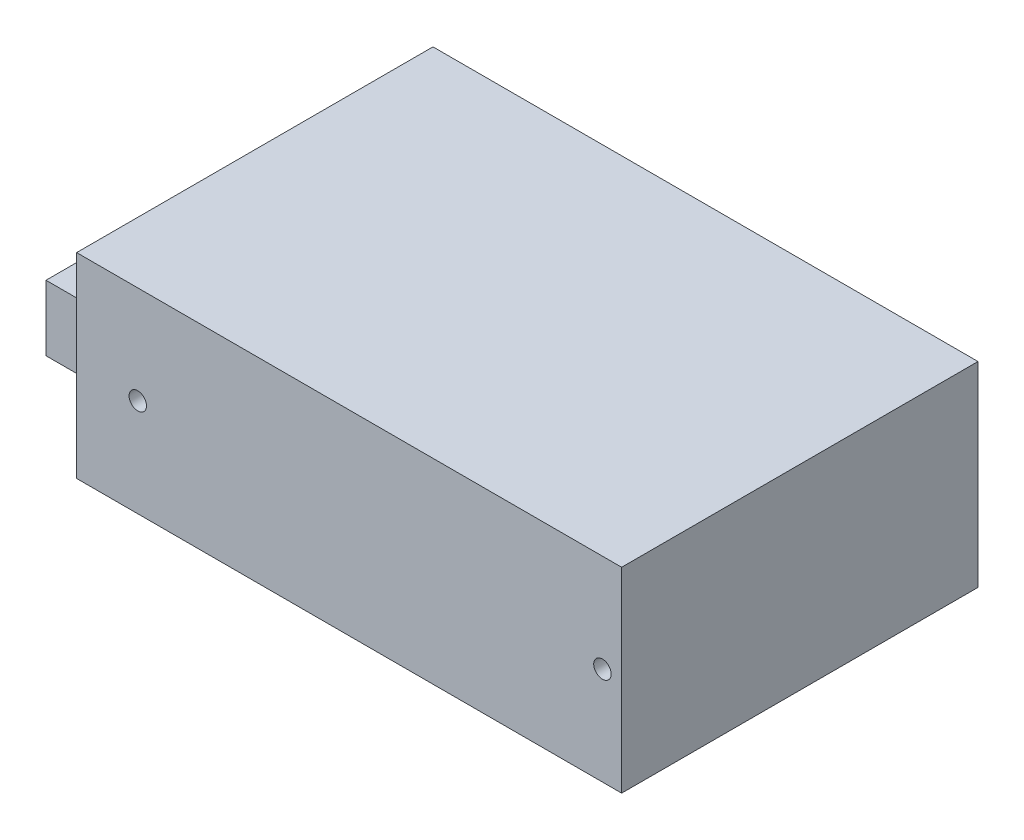
ISO-10303-21;
HEADER;
FILE_DESCRIPTION(('STEP AP214'),'2;1');
FILE_NAME('part.step','',(''),(''),'','','');
FILE_SCHEMA(('AUTOMOTIVE_DESIGN { 1 0 10303 214 1 1 1 1 }'));
ENDSEC;
DATA;
#1=APPLICATION_CONTEXT('core data for automotive mechanical design processes');
#2=APPLICATION_PROTOCOL_DEFINITION('international standard','automotive_design',2000,#1);
#3=PRODUCT_CONTEXT('',#1,'mechanical');
#4=PRODUCT('Part','Part','',(#3));
#5=PRODUCT_RELATED_PRODUCT_CATEGORY('part','',(#4));
#6=PRODUCT_DEFINITION_FORMATION('','',#4);
#7=PRODUCT_DEFINITION_CONTEXT('part definition',#1,'design');
#8=PRODUCT_DEFINITION('design','',#6,#7);
#9=PRODUCT_DEFINITION_SHAPE('','',#8);
#10=(LENGTH_UNIT() NAMED_UNIT(*) SI_UNIT(.MILLI.,.METRE.));
#11=(NAMED_UNIT(*) PLANE_ANGLE_UNIT() SI_UNIT($,.RADIAN.));
#12=(NAMED_UNIT(*) SI_UNIT($,.STERADIAN.) SOLID_ANGLE_UNIT());
#13=UNCERTAINTY_MEASURE_WITH_UNIT(LENGTH_MEASURE(1.E-05),#10,'distance_accuracy_value','');
#14=(GEOMETRIC_REPRESENTATION_CONTEXT(3) GLOBAL_UNCERTAINTY_ASSIGNED_CONTEXT((#13)) GLOBAL_UNIT_ASSIGNED_CONTEXT((#10,
#11,#12)) REPRESENTATION_CONTEXT('',''));
#15=CARTESIAN_POINT('',(0.,0.,0.));
#16=DIRECTION('',(0.,0.,1.));
#17=DIRECTION('',(1.,0.,0.));
#18=AXIS2_PLACEMENT_3D('',#15,#16,#17);
#19=CARTESIAN_POINT('',(-39.,28.,25.5));
#20=DIRECTION('',(1.,0.,0.));
#21=DIRECTION('',(0.,0.,-1.));
#22=AXIS2_PLACEMENT_3D('',#19,#20,#21);
#23=PLANE('',#22);
#24=DIRECTION('',(0.,0.,1.));
#25=VECTOR('',#24,1.);
#26=CARTESIAN_POINT('',(-39.,0.,25.5));
#27=LINE('',#26,#25);
#28=CARTESIAN_POINT('',(-39.,0.,-25.5));
#29=VERTEX_POINT('',#28);
#30=CARTESIAN_POINT('',(-39.,0.,25.5));
#31=VERTEX_POINT('',#30);
#32=EDGE_CURVE('E165',#29,#31,#27,.T.);
#33=ORIENTED_EDGE('',*,*,#32,.T.);
#34=DIRECTION('',(0.,-1.,0.));
#35=VECTOR('',#34,1.);
#36=CARTESIAN_POINT('',(-39.,28.,25.5));
#37=LINE('',#36,#35);
#38=CARTESIAN_POINT('',(-39.,28.,25.5));
#39=VERTEX_POINT('',#38);
#40=EDGE_CURVE('E11',#39,#31,#37,.T.);
#41=ORIENTED_EDGE('',*,*,#40,.F.);
#42=DIRECTION('',(0.,0.,1.));
#43=VECTOR('',#42,1.);
#44=CARTESIAN_POINT('',(-39.,28.,25.5));
#45=LINE('',#44,#43);
#46=CARTESIAN_POINT('',(-39.,28.,-25.5));
#47=VERTEX_POINT('',#46);
#48=EDGE_CURVE('E166',#47,#39,#45,.T.);
#49=ORIENTED_EDGE('',*,*,#48,.F.);
#50=DIRECTION('',(0.,-1.,0.));
#51=VECTOR('',#50,1.);
#52=CARTESIAN_POINT('',(-39.,28.,-25.5));
#53=LINE('',#52,#51);
#54=EDGE_CURVE('E176',#47,#29,#53,.T.);
#55=ORIENTED_EDGE('',*,*,#54,.T.);
#56=EDGE_LOOP('',(#33,#41,#49,#55));
#57=FACE_BOUND('',#56,.T.);
#58=DIRECTION('',(0.,-1.,0.));
#59=VECTOR('',#58,1.);
#60=CARTESIAN_POINT('',(-39.,3.40163827483973,-20.6707501637126));
#61=LINE('',#60,#59);
#62=CARTESIAN_POINT('',(-39.,12.7639627764704,-20.6707501637126));
#63=VERTEX_POINT('',#62);
#64=CARTESIAN_POINT('',(-39.,3.40163827483974,-20.6707501637126));
#65=VERTEX_POINT('',#64);
#66=EDGE_CURVE('E135',#63,#65,#61,.T.);
#67=ORIENTED_EDGE('',*,*,#66,.F.);
#68=DIRECTION('',(0.,0.,-1.));
#69=VECTOR('',#68,1.);
#70=CARTESIAN_POINT('',(-39.,12.7639627764704,-20.6707501637126));
#71=LINE('',#70,#69);
#72=CARTESIAN_POINT('',(-39.,12.7639627764704,15.8843932555756));
#73=VERTEX_POINT('',#72);
#74=EDGE_CURVE('E132',#73,#63,#71,.T.);
#75=ORIENTED_EDGE('',*,*,#74,.F.);
#76=DIRECTION('',(0.,1.,0.));
#77=VECTOR('',#76,1.);
#78=CARTESIAN_POINT('',(-39.,3.40163827483973,15.8843932555756));
#79=LINE('',#78,#77);
#80=CARTESIAN_POINT('',(-39.,3.40163827483974,15.8843932555756));
#81=VERTEX_POINT('',#80);
#82=EDGE_CURVE('E58',#81,#73,#79,.T.);
#83=ORIENTED_EDGE('',*,*,#82,.F.);
#84=DIRECTION('',(0.,0.,1.));
#85=VECTOR('',#84,1.);
#86=CARTESIAN_POINT('',(-39.,3.40163827483973,-20.6707501637126));
#87=LINE('',#86,#85);
#88=EDGE_CURVE('E53',#65,#81,#87,.T.);
#89=ORIENTED_EDGE('',*,*,#88,.F.);
#90=EDGE_LOOP('',(#67,#75,#83,#89));
#91=FACE_BOUND('',#90,.T.);
#92=ADVANCED_FACE('F39',(#57,#91),#23,.F.);
#93=CARTESIAN_POINT('',(39.,28.,25.5));
#94=DIRECTION('',(0.,0.,-1.));
#95=DIRECTION('',(-1.,0.,0.));
#96=AXIS2_PLACEMENT_3D('',#93,#94,#95);
#97=PLANE('',#96);
#98=CARTESIAN_POINT('',(36.25,14.,25.5));
#99=DIRECTION('',(0.,0.,1.));
#100=DIRECTION('',(1.,0.,0.));
#101=AXIS2_PLACEMENT_3D('',#98,#99,#100);
#102=CIRCLE('',#101,1.24999999999999);
#103=CARTESIAN_POINT('',(37.5,14.,25.5));
#104=VERTEX_POINT('',#103);
#105=EDGE_CURVE('E153',#104,#104,#102,.T.);
#106=ORIENTED_EDGE('',*,*,#105,.F.);
#107=EDGE_LOOP('',(#106));
#108=FACE_BOUND('',#107,.T.);
#109=CARTESIAN_POINT('',(-30.25,14.,25.5));
#110=DIRECTION('',(0.,0.,1.));
#111=DIRECTION('',(1.,0.,0.));
#112=AXIS2_PLACEMENT_3D('',#109,#110,#111);
#113=CIRCLE('',#112,1.24999999999999);
#114=CARTESIAN_POINT('',(-29.,14.,25.5));
#115=VERTEX_POINT('',#114);
#116=EDGE_CURVE('E159',#115,#115,#113,.T.);
#117=ORIENTED_EDGE('',*,*,#116,.F.);
#118=EDGE_LOOP('',(#117));
#119=FACE_BOUND('',#118,.T.);
#120=DIRECTION('',(1.,0.,0.));
#121=VECTOR('',#120,1.);
#122=CARTESIAN_POINT('',(39.,0.,25.5));
#123=LINE('',#122,#121);
#124=CARTESIAN_POINT('',(39.,0.,25.5));
#125=VERTEX_POINT('',#124);
#126=EDGE_CURVE('E179',#31,#125,#123,.T.);
#127=ORIENTED_EDGE('',*,*,#126,.T.);
#128=DIRECTION('',(0.,-1.,0.));
#129=VECTOR('',#128,1.);
#130=CARTESIAN_POINT('',(39.,28.,25.5));
#131=LINE('',#130,#129);
#132=CARTESIAN_POINT('',(39.,28.,25.5));
#133=VERTEX_POINT('',#132);
#134=EDGE_CURVE('E46',#133,#125,#131,.T.);
#135=ORIENTED_EDGE('',*,*,#134,.F.);
#136=DIRECTION('',(1.,0.,0.));
#137=VECTOR('',#136,1.);
#138=CARTESIAN_POINT('',(39.,28.,25.5));
#139=LINE('',#138,#137);
#140=EDGE_CURVE('E169',#39,#133,#139,.T.);
#141=ORIENTED_EDGE('',*,*,#140,.F.);
#142=ORIENTED_EDGE('',*,*,#40,.T.);
#143=EDGE_LOOP('',(#127,#135,#141,#142));
#144=FACE_BOUND('',#143,.T.);
#145=ADVANCED_FACE('F209',(#108,#119,#144),#97,.F.);
#146=CARTESIAN_POINT('',(39.,28.,25.5));
#147=DIRECTION('',(-1.,0.,0.));
#148=DIRECTION('',(0.,0.,1.));
#149=AXIS2_PLACEMENT_3D('',#146,#147,#148);
#150=PLANE('',#149);
#151=DIRECTION('',(0.,0.,-1.));
#152=VECTOR('',#151,1.);
#153=CARTESIAN_POINT('',(39.,0.,25.5));
#154=LINE('',#153,#152);
#155=CARTESIAN_POINT('',(39.,0.,-25.5));
#156=VERTEX_POINT('',#155);
#157=EDGE_CURVE('E181',#125,#156,#154,.T.);
#158=ORIENTED_EDGE('',*,*,#157,.T.);
#159=DIRECTION('',(0.,-1.,0.));
#160=VECTOR('',#159,1.);
#161=CARTESIAN_POINT('',(39.,28.,-25.5));
#162=LINE('',#161,#160);
#163=CARTESIAN_POINT('',(39.,28.,-25.5));
#164=VERTEX_POINT('',#163);
#165=EDGE_CURVE('E186',#164,#156,#162,.T.);
#166=ORIENTED_EDGE('',*,*,#165,.F.);
#167=DIRECTION('',(0.,0.,-1.));
#168=VECTOR('',#167,1.);
#169=CARTESIAN_POINT('',(39.,28.,25.5));
#170=LINE('',#169,#168);
#171=EDGE_CURVE('E172',#133,#164,#170,.T.);
#172=ORIENTED_EDGE('',*,*,#171,.F.);
#173=ORIENTED_EDGE('',*,*,#134,.T.);
#174=EDGE_LOOP('',(#158,#166,#172,#173));
#175=FACE_BOUND('',#174,.T.);
#176=ADVANCED_FACE('F193',(#175),#150,.F.);
#177=CARTESIAN_POINT('',(39.,28.,-25.5));
#178=DIRECTION('',(0.,0.,1.));
#179=DIRECTION('',(1.,0.,0.));
#180=AXIS2_PLACEMENT_3D('',#177,#178,#179);
#181=PLANE('',#180);
#182=DIRECTION('',(-1.,0.,0.));
#183=VECTOR('',#182,1.);
#184=CARTESIAN_POINT('',(39.,0.,-25.5));
#185=LINE('',#184,#183);
#186=EDGE_CURVE('E170',#156,#29,#185,.T.);
#187=ORIENTED_EDGE('',*,*,#186,.T.);
#188=ORIENTED_EDGE('',*,*,#54,.F.);
#189=DIRECTION('',(-1.,0.,0.));
#190=VECTOR('',#189,1.);
#191=CARTESIAN_POINT('',(39.,28.,-25.5));
#192=LINE('',#191,#190);
#193=EDGE_CURVE('E174',#164,#47,#192,.T.);
#194=ORIENTED_EDGE('',*,*,#193,.F.);
#195=ORIENTED_EDGE('',*,*,#165,.T.);
#196=EDGE_LOOP('',(#187,#188,#194,#195));
#197=FACE_BOUND('',#196,.T.);
#198=ADVANCED_FACE('F202',(#197),#181,.F.);
#199=CARTESIAN_POINT('',(0.,28.,0.));
#200=DIRECTION('',(0.,1.,0.));
#201=DIRECTION('',(0.,0.,1.));
#202=AXIS2_PLACEMENT_3D('',#199,#200,#201);
#203=PLANE('',#202);
#204=ORIENTED_EDGE('',*,*,#48,.T.);
#205=ORIENTED_EDGE('',*,*,#140,.T.);
#206=ORIENTED_EDGE('',*,*,#171,.T.);
#207=ORIENTED_EDGE('',*,*,#193,.T.);
#208=EDGE_LOOP('',(#204,#205,#206,#207));
#209=FACE_BOUND('',#208,.T.);
#210=ADVANCED_FACE('F208',(#209),#203,.T.);
#211=CARTESIAN_POINT('',(0.,0.,0.));
#212=DIRECTION('',(0.,1.,0.));
#213=DIRECTION('',(0.,0.,1.));
#214=AXIS2_PLACEMENT_3D('',#211,#212,#213);
#215=PLANE('',#214);
#216=CARTESIAN_POINT('',(28.,0.,0.100000000000003));
#217=DIRECTION('',(0.,-1.,0.));
#218=DIRECTION('',(0.,0.,-1.));
#219=AXIS2_PLACEMENT_3D('',#216,#217,#218);
#220=CIRCLE('',#219,1.24999999999999);
#221=CARTESIAN_POINT('',(28.,0.,-1.14999999999998));
#222=VERTEX_POINT('',#221);
#223=EDGE_CURVE('E136',#222,#222,#220,.T.);
#224=ORIENTED_EDGE('',*,*,#223,.F.);
#225=EDGE_LOOP('',(#224));
#226=FACE_BOUND('',#225,.T.);
#227=CARTESIAN_POINT('',(-27.,0.,0.100000000000003));
#228=DIRECTION('',(0.,-1.,0.));
#229=DIRECTION('',(0.,0.,-1.));
#230=AXIS2_PLACEMENT_3D('',#227,#228,#229);
#231=CIRCLE('',#230,1.24999999999999);
#232=CARTESIAN_POINT('',(-27.,0.,-1.14999999999998));
#233=VERTEX_POINT('',#232);
#234=EDGE_CURVE('E147',#233,#233,#231,.T.);
#235=ORIENTED_EDGE('',*,*,#234,.F.);
#236=EDGE_LOOP('',(#235));
#237=FACE_BOUND('',#236,.T.);
#238=ORIENTED_EDGE('',*,*,#32,.F.);
#239=ORIENTED_EDGE('',*,*,#186,.F.);
#240=ORIENTED_EDGE('',*,*,#157,.F.);
#241=ORIENTED_EDGE('',*,*,#126,.F.);
#242=EDGE_LOOP('',(#238,#239,#240,#241));
#243=FACE_BOUND('',#242,.T.);
#244=ADVANCED_FACE('F199',(#226,#237,#243),#215,.F.);
#245=CARTESIAN_POINT('',(-30.25,14.,20.));
#246=DIRECTION('',(0.,0.,1.));
#247=DIRECTION('',(1.,0.,0.));
#248=AXIS2_PLACEMENT_3D('',#245,#246,#247);
#249=CONICAL_SURFACE('',#248,1.25,1.02974425867665);
#250=CARTESIAN_POINT('',(-30.25,14.,19.2489242262155));
#251=VERTEX_POINT('',#250);
#252=VERTEX_LOOP('',#251);
#253=FACE_BOUND('',#252,.T.);
#254=CARTESIAN_POINT('',(-30.25,14.,20.));
#255=DIRECTION('',(0.,0.,1.));
#256=DIRECTION('',(1.,0.,0.));
#257=AXIS2_PLACEMENT_3D('',#254,#255,#256);
#258=CIRCLE('',#257,1.25);
#259=CARTESIAN_POINT('',(-29.,14.,20.));
#260=VERTEX_POINT('',#259);
#261=EDGE_CURVE('E162',#260,#260,#258,.T.);
#262=ORIENTED_EDGE('',*,*,#261,.T.);
#263=EDGE_LOOP('',(#262));
#264=FACE_BOUND('',#263,.T.);
#265=ADVANCED_FACE('F224',(#253,#264),#249,.F.);
#266=CARTESIAN_POINT('',(-30.25,14.,25.5));
#267=DIRECTION('',(0.,0.,1.));
#268=DIRECTION('',(1.,0.,0.));
#269=AXIS2_PLACEMENT_3D('',#266,#267,#268);
#270=CYLINDRICAL_SURFACE('',#269,1.24999999999999);
#271=ORIENTED_EDGE('',*,*,#261,.F.);
#272=EDGE_LOOP('',(#271));
#273=FACE_BOUND('',#272,.T.);
#274=ORIENTED_EDGE('',*,*,#116,.T.);
#275=EDGE_LOOP('',(#274));
#276=FACE_BOUND('',#275,.T.);
#277=ADVANCED_FACE('F230',(#273,#276),#270,.F.);
#278=CARTESIAN_POINT('',(36.25,14.,20.));
#279=DIRECTION('',(0.,0.,1.));
#280=DIRECTION('',(1.,0.,0.));
#281=AXIS2_PLACEMENT_3D('',#278,#279,#280);
#282=CONICAL_SURFACE('',#281,1.25,1.02974425867666);
#283=CARTESIAN_POINT('',(36.25,14.,19.2489242262155));
#284=VERTEX_POINT('',#283);
#285=VERTEX_LOOP('',#284);
#286=FACE_BOUND('',#285,.T.);
#287=CARTESIAN_POINT('',(36.25,14.,20.));
#288=DIRECTION('',(0.,0.,1.));
#289=DIRECTION('',(1.,0.,0.));
#290=AXIS2_PLACEMENT_3D('',#287,#288,#289);
#291=CIRCLE('',#290,1.25);
#292=CARTESIAN_POINT('',(37.5,14.,20.));
#293=VERTEX_POINT('',#292);
#294=EDGE_CURVE('E156',#293,#293,#291,.T.);
#295=ORIENTED_EDGE('',*,*,#294,.T.);
#296=EDGE_LOOP('',(#295));
#297=FACE_BOUND('',#296,.T.);
#298=ADVANCED_FACE('F234',(#286,#297),#282,.F.);
#299=CARTESIAN_POINT('',(36.25,14.,25.5));
#300=DIRECTION('',(0.,0.,1.));
#301=DIRECTION('',(1.,0.,0.));
#302=AXIS2_PLACEMENT_3D('',#299,#300,#301);
#303=CYLINDRICAL_SURFACE('',#302,1.24999999999999);
#304=ORIENTED_EDGE('',*,*,#294,.F.);
#305=EDGE_LOOP('',(#304));
#306=FACE_BOUND('',#305,.T.);
#307=ORIENTED_EDGE('',*,*,#105,.T.);
#308=EDGE_LOOP('',(#307));
#309=FACE_BOUND('',#308,.T.);
#310=ADVANCED_FACE('F238',(#306,#309),#303,.F.);
#311=CARTESIAN_POINT('',(-27.,5.50000000000001,0.100000000000003));
#312=DIRECTION('',(0.,-1.,0.));
#313=DIRECTION('',(0.,0.,-1.));
#314=AXIS2_PLACEMENT_3D('',#311,#312,#313);
#315=CONICAL_SURFACE('',#314,1.24999999999999,1.02974425867665);
#316=CARTESIAN_POINT('',(-27.,6.25107577378445,0.100000000000003));
#317=VERTEX_POINT('',#316);
#318=VERTEX_LOOP('',#317);
#319=FACE_BOUND('',#318,.T.);
#320=CARTESIAN_POINT('',(-27.,5.50000000000001,0.100000000000003));
#321=DIRECTION('',(0.,-1.,0.));
#322=DIRECTION('',(0.,0.,-1.));
#323=AXIS2_PLACEMENT_3D('',#320,#321,#322);
#324=CIRCLE('',#323,1.24999999999999);
#325=CARTESIAN_POINT('',(-27.,5.50000000000001,-1.14999999999998));
#326=VERTEX_POINT('',#325);
#327=EDGE_CURVE('E150',#326,#326,#324,.T.);
#328=ORIENTED_EDGE('',*,*,#327,.T.);
#329=EDGE_LOOP('',(#328));
#330=FACE_BOUND('',#329,.T.);
#331=ADVANCED_FACE('F242',(#319,#330),#315,.F.);
#332=CARTESIAN_POINT('',(-27.,0.,0.100000000000003));
#333=DIRECTION('',(0.,-1.,0.));
#334=DIRECTION('',(0.,0.,-1.));
#335=AXIS2_PLACEMENT_3D('',#332,#333,#334);
#336=CYLINDRICAL_SURFACE('',#335,1.24999999999999);
#337=ORIENTED_EDGE('',*,*,#327,.F.);
#338=EDGE_LOOP('',(#337));
#339=FACE_BOUND('',#338,.T.);
#340=ORIENTED_EDGE('',*,*,#234,.T.);
#341=EDGE_LOOP('',(#340));
#342=FACE_BOUND('',#341,.T.);
#343=ADVANCED_FACE('F246',(#339,#342),#336,.F.);
#344=CARTESIAN_POINT('',(28.,5.50000000000001,0.100000000000003));
#345=DIRECTION('',(0.,-1.,0.));
#346=DIRECTION('',(0.,0.,-1.));
#347=AXIS2_PLACEMENT_3D('',#344,#345,#346);
#348=CONICAL_SURFACE('',#347,1.24999999999999,1.02974425867665);
#349=CARTESIAN_POINT('',(28.,6.25107577378445,0.100000000000003));
#350=VERTEX_POINT('',#349);
#351=VERTEX_LOOP('',#350);
#352=FACE_BOUND('',#351,.T.);
#353=CARTESIAN_POINT('',(28.,5.50000000000001,0.100000000000003));
#354=DIRECTION('',(0.,-1.,0.));
#355=DIRECTION('',(0.,0.,-1.));
#356=AXIS2_PLACEMENT_3D('',#353,#354,#355);
#357=CIRCLE('',#356,1.24999999999999);
#358=CARTESIAN_POINT('',(28.,5.50000000000001,-1.14999999999998));
#359=VERTEX_POINT('',#358);
#360=EDGE_CURVE('E139',#359,#359,#357,.T.);
#361=ORIENTED_EDGE('',*,*,#360,.T.);
#362=EDGE_LOOP('',(#361));
#363=FACE_BOUND('',#362,.T.);
#364=ADVANCED_FACE('F250',(#352,#363),#348,.F.);
#365=CARTESIAN_POINT('',(28.,0.,0.100000000000003));
#366=DIRECTION('',(0.,-1.,0.));
#367=DIRECTION('',(0.,0.,-1.));
#368=AXIS2_PLACEMENT_3D('',#365,#366,#367);
#369=CYLINDRICAL_SURFACE('',#368,1.24999999999999);
#370=ORIENTED_EDGE('',*,*,#360,.F.);
#371=EDGE_LOOP('',(#370));
#372=FACE_BOUND('',#371,.T.);
#373=ORIENTED_EDGE('',*,*,#223,.T.);
#374=EDGE_LOOP('',(#373));
#375=FACE_BOUND('',#374,.T.);
#376=ADVANCED_FACE('F254',(#372,#375),#369,.F.);
#377=CARTESIAN_POINT('',(-53.,3.40163827483973,-20.6707501637126));
#378=DIRECTION('',(0.,0.,1.));
#379=DIRECTION('',(1.,0.,0.));
#380=AXIS2_PLACEMENT_3D('',#377,#378,#379);
#381=PLANE('',#380);
#382=ORIENTED_EDGE('',*,*,#66,.T.);
#383=DIRECTION('',(1.,0.,0.));
#384=VECTOR('',#383,1.);
#385=CARTESIAN_POINT('',(-53.,3.40163827483973,-20.6707501637126));
#386=LINE('',#385,#384);
#387=CARTESIAN_POINT('',(-53.,3.40163827483973,-20.6707501637126));
#388=VERTEX_POINT('',#387);
#389=EDGE_CURVE('E116',#388,#65,#386,.T.);
#390=ORIENTED_EDGE('',*,*,#389,.F.);
#391=DIRECTION('',(0.,-1.,0.));
#392=VECTOR('',#391,1.);
#393=CARTESIAN_POINT('',(-53.,3.40163827483973,-20.6707501637126));
#394=LINE('',#393,#392);
#395=CARTESIAN_POINT('',(-53.,12.7639627764704,-20.6707501637126));
#396=VERTEX_POINT('',#395);
#397=EDGE_CURVE('E123',#396,#388,#394,.T.);
#398=ORIENTED_EDGE('',*,*,#397,.F.);
#399=DIRECTION('',(1.,0.,0.));
#400=VECTOR('',#399,1.);
#401=CARTESIAN_POINT('',(-53.,12.7639627764704,-20.6707501637126));
#402=LINE('',#401,#400);
#403=EDGE_CURVE('E402',#396,#63,#402,.T.);
#404=ORIENTED_EDGE('',*,*,#403,.T.);
#405=EDGE_LOOP('',(#382,#390,#398,#404));
#406=FACE_BOUND('',#405,.T.);
#407=ADVANCED_FACE('F134',(#406),#381,.F.);
#408=CARTESIAN_POINT('',(-53.,3.40163827483973,-20.6707501637126));
#409=DIRECTION('',(0.,1.,0.));
#410=DIRECTION('',(0.,0.,1.));
#411=AXIS2_PLACEMENT_3D('',#408,#409,#410);
#412=PLANE('',#411);
#413=ORIENTED_EDGE('',*,*,#88,.T.);
#414=DIRECTION('',(1.,0.,0.));
#415=VECTOR('',#414,1.);
#416=CARTESIAN_POINT('',(-53.,3.40163827483973,15.8843932555756));
#417=LINE('',#416,#415);
#418=CARTESIAN_POINT('',(-53.,3.40163827483973,15.8843932555756));
#419=VERTEX_POINT('',#418);
#420=EDGE_CURVE('E119',#419,#81,#417,.T.);
#421=ORIENTED_EDGE('',*,*,#420,.F.);
#422=DIRECTION('',(0.,0.,1.));
#423=VECTOR('',#422,1.);
#424=CARTESIAN_POINT('',(-53.,3.40163827483973,-20.6707501637126));
#425=LINE('',#424,#423);
#426=EDGE_CURVE('E112',#388,#419,#425,.T.);
#427=ORIENTED_EDGE('',*,*,#426,.F.);
#428=ORIENTED_EDGE('',*,*,#389,.T.);
#429=EDGE_LOOP('',(#413,#421,#427,#428));
#430=FACE_BOUND('',#429,.T.);
#431=ADVANCED_FACE('F114',(#430),#412,.F.);
#432=CARTESIAN_POINT('',(-53.,3.40163827483973,15.8843932555756));
#433=DIRECTION('',(0.,0.,-1.));
#434=DIRECTION('',(-1.,0.,0.));
#435=AXIS2_PLACEMENT_3D('',#432,#433,#434);
#436=PLANE('',#435);
#437=ORIENTED_EDGE('',*,*,#82,.T.);
#438=DIRECTION('',(1.,0.,0.));
#439=VECTOR('',#438,1.);
#440=CARTESIAN_POINT('',(-53.,12.7639627764704,15.8843932555756));
#441=LINE('',#440,#439);
#442=CARTESIAN_POINT('',(-53.,12.7639627764704,15.8843932555756));
#443=VERTEX_POINT('',#442);
#444=EDGE_CURVE('E141',#443,#73,#441,.T.);
#445=ORIENTED_EDGE('',*,*,#444,.F.);
#446=DIRECTION('',(0.,1.,0.));
#447=VECTOR('',#446,1.);
#448=CARTESIAN_POINT('',(-53.,3.40163827483973,15.8843932555756));
#449=LINE('',#448,#447);
#450=EDGE_CURVE('E122',#419,#443,#449,.T.);
#451=ORIENTED_EDGE('',*,*,#450,.F.);
#452=ORIENTED_EDGE('',*,*,#420,.T.);
#453=EDGE_LOOP('',(#437,#445,#451,#452));
#454=FACE_BOUND('',#453,.T.);
#455=ADVANCED_FACE('F263',(#454),#436,.F.);
#456=CARTESIAN_POINT('',(-53.,12.7639627764704,-20.6707501637126));
#457=DIRECTION('',(0.,-1.,0.));
#458=DIRECTION('',(0.,0.,-1.));
#459=AXIS2_PLACEMENT_3D('',#456,#457,#458);
#460=PLANE('',#459);
#461=ORIENTED_EDGE('',*,*,#74,.T.);
#462=ORIENTED_EDGE('',*,*,#403,.F.);
#463=DIRECTION('',(0.,0.,-1.));
#464=VECTOR('',#463,1.);
#465=CARTESIAN_POINT('',(-53.,12.7639627764704,-20.6707501637126));
#466=LINE('',#465,#464);
#467=EDGE_CURVE('E128',#443,#396,#466,.T.);
#468=ORIENTED_EDGE('',*,*,#467,.F.);
#469=ORIENTED_EDGE('',*,*,#444,.T.);
#470=EDGE_LOOP('',(#461,#462,#468,#469));
#471=FACE_BOUND('',#470,.T.);
#472=ADVANCED_FACE('F266',(#471),#460,.F.);
#473=CARTESIAN_POINT('',(-53.,0.,0.));
#474=DIRECTION('',(1.,0.,0.));
#475=DIRECTION('',(0.,0.,-1.));
#476=AXIS2_PLACEMENT_3D('',#473,#474,#475);
#477=PLANE('',#476);
#478=ORIENTED_EDGE('',*,*,#397,.T.);
#479=ORIENTED_EDGE('',*,*,#426,.T.);
#480=ORIENTED_EDGE('',*,*,#450,.T.);
#481=ORIENTED_EDGE('',*,*,#467,.T.);
#482=EDGE_LOOP('',(#478,#479,#480,#481));
#483=FACE_BOUND('',#482,.T.);
#484=ADVANCED_FACE('F126',(#483),#477,.F.);
#485=CLOSED_SHELL('',(#92,#145,#176,#198,#210,#244,#265,#277,#298,#310,#331,#343,#364,#376,#407,
#431,#455,#472,#484));
#486=MANIFOLD_SOLID_BREP('B2',#485);
#487=ADVANCED_BREP_SHAPE_REPRESENTATION('',(#18,#486),#14);
#488=SHAPE_DEFINITION_REPRESENTATION(#9,#487);
ENDSEC;
END-ISO-10303-21;
